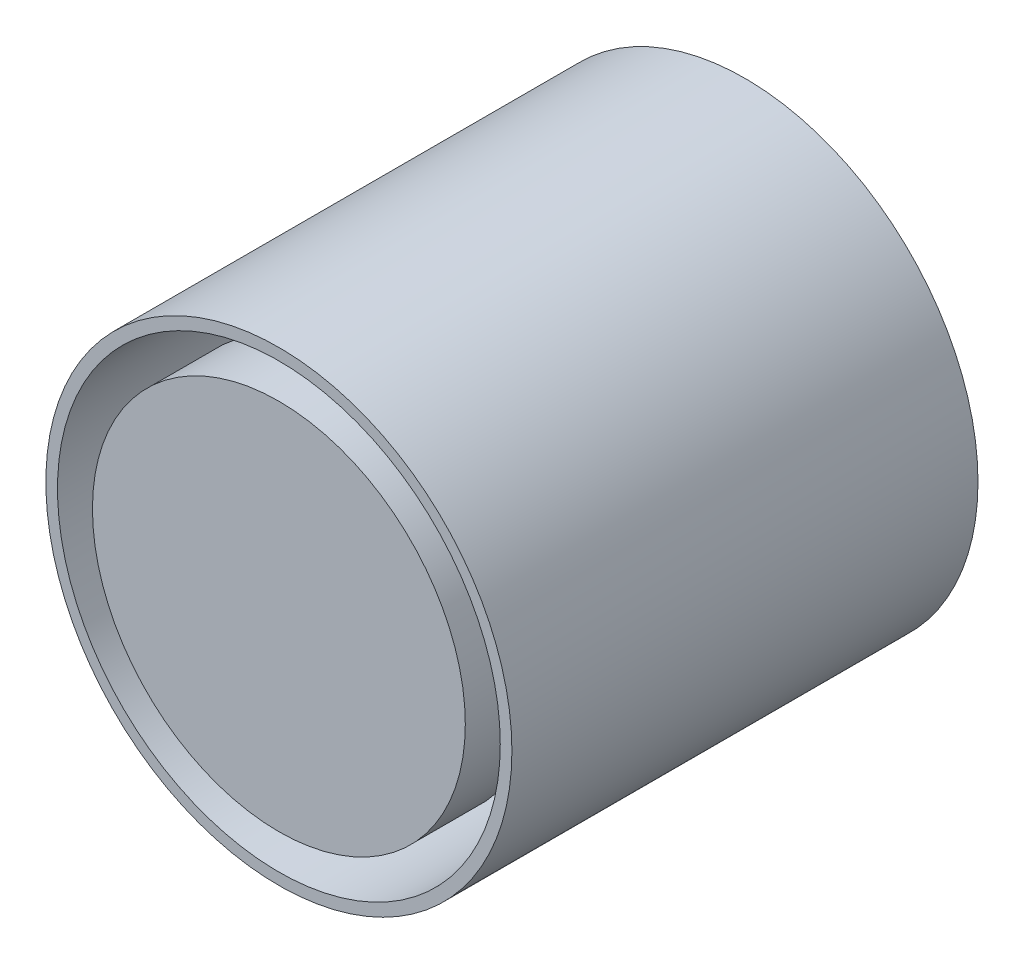
ISO-10303-21;
HEADER;
FILE_DESCRIPTION(('STEP AP214'),'2;1');
FILE_NAME('part.step','',(''),(''),'','','');
FILE_SCHEMA(('AUTOMOTIVE_DESIGN { 1 0 10303 214 1 1 1 1 }'));
ENDSEC;
DATA;
#1=APPLICATION_CONTEXT('core data for automotive mechanical design processes');
#2=APPLICATION_PROTOCOL_DEFINITION('international standard','automotive_design',2000,#1);
#3=PRODUCT_CONTEXT('',#1,'mechanical');
#4=PRODUCT('Part','Part','',(#3));
#5=PRODUCT_RELATED_PRODUCT_CATEGORY('part','',(#4));
#6=PRODUCT_DEFINITION_FORMATION('','',#4);
#7=PRODUCT_DEFINITION_CONTEXT('part definition',#1,'design');
#8=PRODUCT_DEFINITION('design','',#6,#7);
#9=PRODUCT_DEFINITION_SHAPE('','',#8);
#10=(LENGTH_UNIT() NAMED_UNIT(*) SI_UNIT(.MILLI.,.METRE.));
#11=(NAMED_UNIT(*) PLANE_ANGLE_UNIT() SI_UNIT($,.RADIAN.));
#12=(NAMED_UNIT(*) SI_UNIT($,.STERADIAN.) SOLID_ANGLE_UNIT());
#13=UNCERTAINTY_MEASURE_WITH_UNIT(LENGTH_MEASURE(1.E-05),#10,'distance_accuracy_value','');
#14=(GEOMETRIC_REPRESENTATION_CONTEXT(3) GLOBAL_UNCERTAINTY_ASSIGNED_CONTEXT((#13)) GLOBAL_UNIT_ASSIGNED_CONTEXT((#10,
#11,#12)) REPRESENTATION_CONTEXT('',''));
#15=CARTESIAN_POINT('',(0.,0.,0.));
#16=DIRECTION('',(0.,0.,1.));
#17=DIRECTION('',(1.,0.,0.));
#18=AXIS2_PLACEMENT_3D('',#15,#16,#17);
#19=CARTESIAN_POINT('',(0.,0.,200.));
#20=DIRECTION('',(0.,0.,-1.));
#21=DIRECTION('',(-1.,0.,0.));
#22=AXIS2_PLACEMENT_3D('',#19,#20,#21);
#23=CYLINDRICAL_SURFACE('',#22,80.);
#24=CARTESIAN_POINT('',(0.,0.,200.));
#25=DIRECTION('',(0.,0.,-1.));
#26=DIRECTION('',(-1.,0.,0.));
#27=AXIS2_PLACEMENT_3D('',#24,#25,#26);
#28=CIRCLE('',#27,80.);
#29=CARTESIAN_POINT('',(-80.,0.,200.));
#30=VERTEX_POINT('',#29);
#31=EDGE_CURVE('E11',#30,#30,#28,.T.);
#32=ORIENTED_EDGE('',*,*,#31,.T.);
#33=EDGE_LOOP('',(#32));
#34=FACE_BOUND('',#33,.T.);
#35=CARTESIAN_POINT('',(0.,0.,170.));
#36=DIRECTION('',(0.,0.,-1.));
#37=DIRECTION('',(-1.,0.,0.));
#38=AXIS2_PLACEMENT_3D('',#35,#36,#37);
#39=CIRCLE('',#38,80.);
#40=CARTESIAN_POINT('',(-80.,0.,170.));
#41=VERTEX_POINT('',#40);
#42=EDGE_CURVE('E51',#41,#41,#39,.T.);
#43=ORIENTED_EDGE('',*,*,#42,.F.);
#44=EDGE_LOOP('',(#43));
#45=FACE_BOUND('',#44,.T.);
#46=ADVANCED_FACE('F48',(#34,#45),#23,.T.);
#47=CARTESIAN_POINT('',(0.,0.,200.));
#48=DIRECTION('',(0.,0.,-1.));
#49=DIRECTION('',(-1.,0.,0.));
#50=AXIS2_PLACEMENT_3D('',#47,#48,#49);
#51=PLANE('',#50);
#52=ORIENTED_EDGE('',*,*,#31,.F.);
#53=EDGE_LOOP('',(#52));
#54=FACE_BOUND('',#53,.T.);
#55=ADVANCED_FACE('F63',(#54),#51,.F.);
#56=CARTESIAN_POINT('',(0.,0.,170.));
#57=DIRECTION('',(0.,0.,-1.));
#58=DIRECTION('',(-1.,0.,0.));
#59=AXIS2_PLACEMENT_3D('',#56,#57,#58);
#60=PLANE('',#59);
#61=ORIENTED_EDGE('',*,*,#42,.T.);
#62=EDGE_LOOP('',(#61));
#63=FACE_BOUND('',#62,.T.);
#64=ADVANCED_FACE('F60',(#63),#60,.T.);
#65=CLOSED_SHELL('',(#46,#55,#64));
#66=MANIFOLD_SOLID_BREP('B2',#65);
#67=CARTESIAN_POINT('',(0.,0.,200.));
#68=DIRECTION('',(0.,0.,-1.));
#69=DIRECTION('',(-1.,0.,0.));
#70=AXIS2_PLACEMENT_3D('',#67,#68,#69);
#71=CYLINDRICAL_SURFACE('',#70,100.);
#72=CARTESIAN_POINT('',(0.,0.,200.));
#73=DIRECTION('',(0.,0.,1.));
#74=DIRECTION('',(1.,0.,0.));
#75=AXIS2_PLACEMENT_3D('',#72,#73,#74);
#76=CIRCLE('',#75,100.);
#77=CARTESIAN_POINT('',(100.,0.,200.));
#78=VERTEX_POINT('',#77);
#79=EDGE_CURVE('E47',#78,#78,#76,.T.);
#80=ORIENTED_EDGE('',*,*,#79,.F.);
#81=EDGE_LOOP('',(#80));
#82=FACE_BOUND('',#81,.T.);
#83=CARTESIAN_POINT('',(0.,0.,0.));
#84=DIRECTION('',(0.,0.,1.));
#85=DIRECTION('',(1.,0.,0.));
#86=AXIS2_PLACEMENT_3D('',#83,#84,#85);
#87=CIRCLE('',#86,100.);
#88=CARTESIAN_POINT('',(100.,0.,0.));
#89=VERTEX_POINT('',#88);
#90=EDGE_CURVE('E101',#89,#89,#87,.T.);
#91=ORIENTED_EDGE('',*,*,#90,.T.);
#92=EDGE_LOOP('',(#91));
#93=FACE_BOUND('',#92,.T.);
#94=ADVANCED_FACE('F94',(#82,#93),#71,.T.);
#95=CARTESIAN_POINT('',(0.,0.,200.));
#96=DIRECTION('',(0.,0.,1.));
#97=DIRECTION('',(1.,0.,0.));
#98=AXIS2_PLACEMENT_3D('',#95,#96,#97);
#99=PLANE('',#98);
#100=CARTESIAN_POINT('',(0.,0.,200.));
#101=DIRECTION('',(0.,0.,1.));
#102=DIRECTION('',(1.,0.,0.));
#103=AXIS2_PLACEMENT_3D('',#100,#101,#102);
#104=CIRCLE('',#103,95.);
#105=CARTESIAN_POINT('',(95.,0.,200.));
#106=VERTEX_POINT('',#105);
#107=EDGE_CURVE('E107',#106,#106,#104,.T.);
#108=ORIENTED_EDGE('',*,*,#107,.F.);
#109=EDGE_LOOP('',(#108));
#110=FACE_BOUND('',#109,.T.);
#111=ORIENTED_EDGE('',*,*,#79,.T.);
#112=EDGE_LOOP('',(#111));
#113=FACE_BOUND('',#112,.T.);
#114=ADVANCED_FACE('F123',(#110,#113),#99,.T.);
#115=CARTESIAN_POINT('',(0.,0.,0.));
#116=DIRECTION('',(0.,0.,1.));
#117=DIRECTION('',(1.,0.,0.));
#118=AXIS2_PLACEMENT_3D('',#115,#116,#117);
#119=PLANE('',#118);
#120=CARTESIAN_POINT('',(0.,0.,0.));
#121=DIRECTION('',(0.,0.,1.));
#122=DIRECTION('',(1.,0.,0.));
#123=AXIS2_PLACEMENT_3D('',#120,#121,#122);
#124=CIRCLE('',#123,95.);
#125=CARTESIAN_POINT('',(95.,0.,0.));
#126=VERTEX_POINT('',#125);
#127=EDGE_CURVE('E97',#126,#126,#124,.T.);
#128=ORIENTED_EDGE('',*,*,#127,.T.);
#129=EDGE_LOOP('',(#128));
#130=FACE_BOUND('',#129,.T.);
#131=ORIENTED_EDGE('',*,*,#90,.F.);
#132=EDGE_LOOP('',(#131));
#133=FACE_BOUND('',#132,.T.);
#134=ADVANCED_FACE('F114',(#130,#133),#119,.F.);
#135=CARTESIAN_POINT('',(0.,0.,-200.));
#136=DIRECTION('',(0.,0.,1.));
#137=DIRECTION('',(1.,0.,0.));
#138=AXIS2_PLACEMENT_3D('',#135,#136,#137);
#139=CYLINDRICAL_SURFACE('',#138,95.);
#140=ORIENTED_EDGE('',*,*,#107,.T.);
#141=EDGE_LOOP('',(#140));
#142=FACE_BOUND('',#141,.T.);
#143=ORIENTED_EDGE('',*,*,#127,.F.);
#144=EDGE_LOOP('',(#143));
#145=FACE_BOUND('',#144,.T.);
#146=ADVANCED_FACE('F117',(#142,#145),#139,.F.);
#147=CLOSED_SHELL('',(#94,#114,#134,#146));
#148=MANIFOLD_SOLID_BREP('B6',#147);
#149=ADVANCED_BREP_SHAPE_REPRESENTATION('',(#18,#66,#148),#14);
#150=SHAPE_DEFINITION_REPRESENTATION(#9,#149);
ENDSEC;
END-ISO-10303-21;
